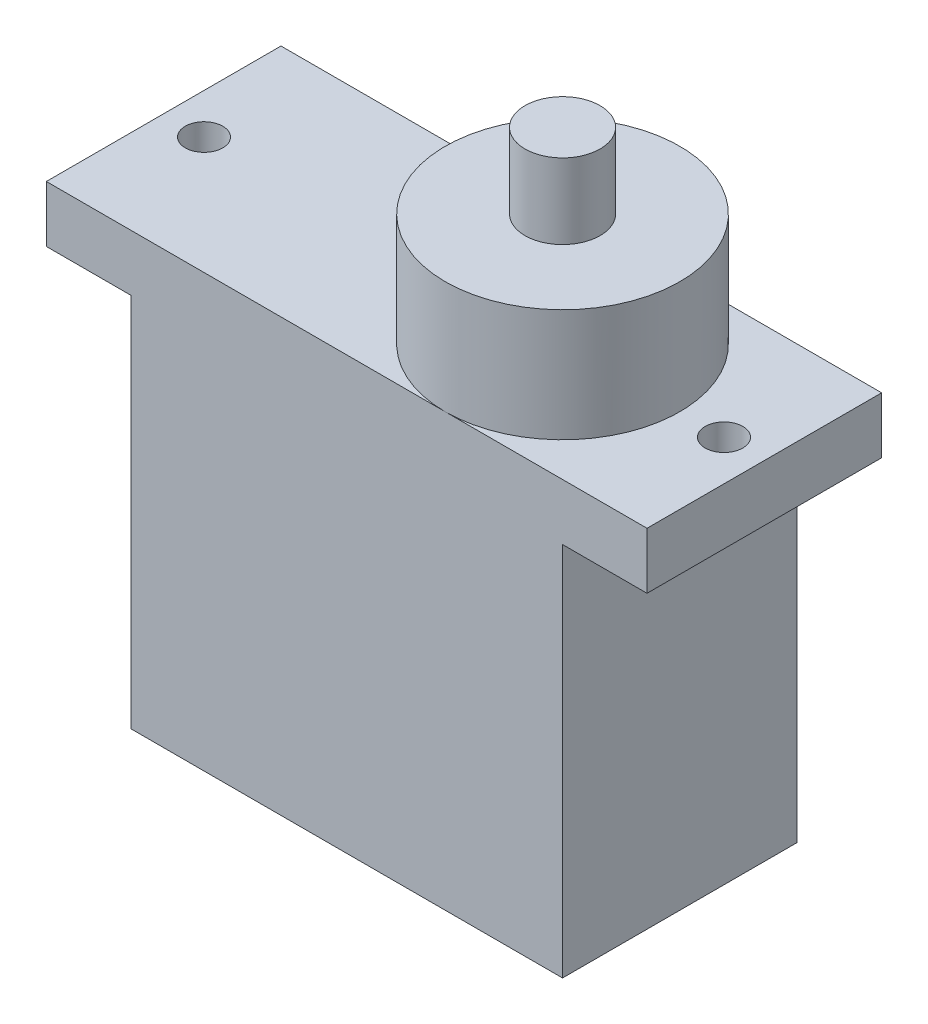
ISO-10303-21;
HEADER;
FILE_DESCRIPTION(('STEP AP214'),'2;1');
FILE_NAME('part.step','',(''),(''),'','','');
FILE_SCHEMA(('AUTOMOTIVE_DESIGN { 1 0 10303 214 1 1 1 1 }'));
ENDSEC;
DATA;
#1=APPLICATION_CONTEXT('core data for automotive mechanical design processes');
#2=APPLICATION_PROTOCOL_DEFINITION('international standard','automotive_design',2000,#1);
#3=PRODUCT_CONTEXT('',#1,'mechanical');
#4=PRODUCT('Part','Part','',(#3));
#5=PRODUCT_RELATED_PRODUCT_CATEGORY('part','',(#4));
#6=PRODUCT_DEFINITION_FORMATION('','',#4);
#7=PRODUCT_DEFINITION_CONTEXT('part definition',#1,'design');
#8=PRODUCT_DEFINITION('design','',#6,#7);
#9=PRODUCT_DEFINITION_SHAPE('','',#8);
#10=(LENGTH_UNIT() NAMED_UNIT(*) SI_UNIT(.MILLI.,.METRE.));
#11=(NAMED_UNIT(*) PLANE_ANGLE_UNIT() SI_UNIT($,.RADIAN.));
#12=(NAMED_UNIT(*) SI_UNIT($,.STERADIAN.) SOLID_ANGLE_UNIT());
#13=UNCERTAINTY_MEASURE_WITH_UNIT(LENGTH_MEASURE(1.E-05),#10,'distance_accuracy_value','');
#14=(GEOMETRIC_REPRESENTATION_CONTEXT(3) GLOBAL_UNCERTAINTY_ASSIGNED_CONTEXT((#13)) GLOBAL_UNIT_ASSIGNED_CONTEXT((#10,
#11,#12)) REPRESENTATION_CONTEXT('',''));
#15=CARTESIAN_POINT('',(0.,0.,0.));
#16=DIRECTION('',(0.,0.,1.));
#17=DIRECTION('',(1.,0.,0.));
#18=AXIS2_PLACEMENT_3D('',#15,#16,#17);
#19=CARTESIAN_POINT('',(0.,23.,0.));
#20=DIRECTION('',(0.,1.,0.));
#21=DIRECTION('',(0.,0.,1.));
#22=AXIS2_PLACEMENT_3D('',#19,#20,#21);
#23=PLANE('',#22);
#24=CARTESIAN_POINT('',(5.25,23.,0.));
#25=DIRECTION('',(0.,1.,0.));
#26=DIRECTION('',(0.,0.,1.));
#27=AXIS2_PLACEMENT_3D('',#24,#25,#26);
#28=CIRCLE('',#27,6.25);
#29=CARTESIAN_POINT('',(5.25,23.,6.25));
#30=VERTEX_POINT('',#29);
#31=CARTESIAN_POINT('',(5.25,23.,-6.25));
#32=VERTEX_POINT('',#31);
#33=EDGE_CURVE('E139',#30,#32,#28,.T.);
#34=ORIENTED_EDGE('',*,*,#33,.F.);
#35=DIRECTION('',(1.,0.,0.));
#36=VECTOR('',#35,1.);
#37=CARTESIAN_POINT('',(-16.,23.,6.25));
#38=LINE('',#37,#36);
#39=CARTESIAN_POINT('',(16.,23.,6.25));
#40=VERTEX_POINT('',#39);
#41=EDGE_CURVE('E127',#30,#40,#38,.T.);
#42=ORIENTED_EDGE('',*,*,#41,.T.);
#43=DIRECTION('',(0.,0.,-1.));
#44=VECTOR('',#43,1.);
#45=CARTESIAN_POINT('',(16.,23.,-6.25));
#46=LINE('',#45,#44);
#47=CARTESIAN_POINT('',(16.,23.,-6.25));
#48=VERTEX_POINT('',#47);
#49=EDGE_CURVE('E170',#40,#48,#46,.T.);
#50=ORIENTED_EDGE('',*,*,#49,.T.);
#51=DIRECTION('',(-1.,0.,0.));
#52=VECTOR('',#51,1.);
#53=CARTESIAN_POINT('',(-16.,23.,-6.25));
#54=LINE('',#53,#52);
#55=EDGE_CURVE('E141',#48,#32,#54,.T.);
#56=ORIENTED_EDGE('',*,*,#55,.T.);
#57=EDGE_LOOP('',(#34,#42,#50,#56));
#58=FACE_BOUND('',#57,.T.);
#59=CARTESIAN_POINT('',(13.85,23.,0.));
#60=DIRECTION('',(0.,1.,0.));
#61=DIRECTION('',(0.,0.,1.));
#62=AXIS2_PLACEMENT_3D('',#59,#60,#61);
#63=CIRCLE('',#62,1.);
#64=CARTESIAN_POINT('',(13.85,23.,0.999999999999999));
#65=VERTEX_POINT('',#64);
#66=EDGE_CURVE('E162',#65,#65,#63,.T.);
#67=ORIENTED_EDGE('',*,*,#66,.F.);
#68=EDGE_LOOP('',(#67));
#69=FACE_BOUND('',#68,.T.);
#70=ADVANCED_FACE('F39',(#58,#69),#23,.T.);
#71=CARTESIAN_POINT('',(11.5,20.,-6.25));
#72=DIRECTION('',(-1.,0.,0.));
#73=DIRECTION('',(0.,0.,1.));
#74=AXIS2_PLACEMENT_3D('',#71,#72,#73);
#75=PLANE('',#74);
#76=DIRECTION('',(0.,0.,-1.));
#77=VECTOR('',#76,1.);
#78=CARTESIAN_POINT('',(11.5,0.,-6.25));
#79=LINE('',#78,#77);
#80=CARTESIAN_POINT('',(11.5,0.,6.25));
#81=VERTEX_POINT('',#80);
#82=CARTESIAN_POINT('',(11.5,0.,-6.25));
#83=VERTEX_POINT('',#82);
#84=EDGE_CURVE('E207',#81,#83,#79,.T.);
#85=ORIENTED_EDGE('',*,*,#84,.T.);
#86=DIRECTION('',(0.,-1.,0.));
#87=VECTOR('',#86,1.);
#88=CARTESIAN_POINT('',(11.5,20.,-6.25));
#89=LINE('',#88,#87);
#90=CARTESIAN_POINT('',(11.5,20.,-6.25));
#91=VERTEX_POINT('',#90);
#92=EDGE_CURVE('E43',#91,#83,#89,.T.);
#93=ORIENTED_EDGE('',*,*,#92,.F.);
#94=DIRECTION('',(0.,0.,-1.));
#95=VECTOR('',#94,1.);
#96=CARTESIAN_POINT('',(11.5,20.,-6.25));
#97=LINE('',#96,#95);
#98=CARTESIAN_POINT('',(11.5,20.,6.25));
#99=VERTEX_POINT('',#98);
#100=EDGE_CURVE('E208',#99,#91,#97,.T.);
#101=ORIENTED_EDGE('',*,*,#100,.F.);
#102=DIRECTION('',(0.,-1.,0.));
#103=VECTOR('',#102,1.);
#104=CARTESIAN_POINT('',(11.5,20.,6.25));
#105=LINE('',#104,#103);
#106=EDGE_CURVE('E65',#99,#81,#105,.T.);
#107=ORIENTED_EDGE('',*,*,#106,.T.);
#108=EDGE_LOOP('',(#85,#93,#101,#107));
#109=FACE_BOUND('',#108,.T.);
#110=ADVANCED_FACE('F41',(#109),#75,.F.);
#111=CARTESIAN_POINT('',(-11.5,20.,-6.25));
#112=DIRECTION('',(0.,0.,1.));
#113=DIRECTION('',(1.,0.,0.));
#114=AXIS2_PLACEMENT_3D('',#111,#112,#113);
#115=PLANE('',#114);
#116=DIRECTION('',(-1.,0.,0.));
#117=VECTOR('',#116,1.);
#118=CARTESIAN_POINT('',(-11.5,0.,-6.25));
#119=LINE('',#118,#117);
#120=CARTESIAN_POINT('',(-11.5,0.,-6.25));
#121=VERTEX_POINT('',#120);
#122=EDGE_CURVE('E217',#83,#121,#119,.T.);
#123=ORIENTED_EDGE('',*,*,#122,.T.);
#124=DIRECTION('',(0.,-1.,0.));
#125=VECTOR('',#124,1.);
#126=CARTESIAN_POINT('',(-11.5,20.,-6.25));
#127=LINE('',#126,#125);
#128=CARTESIAN_POINT('',(-11.5,20.,-6.25));
#129=VERTEX_POINT('',#128);
#130=EDGE_CURVE('E150',#129,#121,#127,.T.);
#131=ORIENTED_EDGE('',*,*,#130,.F.);
#132=DIRECTION('',(-1.,0.,0.));
#133=VECTOR('',#132,1.);
#134=CARTESIAN_POINT('',(-16.,20.,-6.25));
#135=LINE('',#134,#133);
#136=CARTESIAN_POINT('',(-16.,20.,-6.25));
#137=VERTEX_POINT('',#136);
#138=EDGE_CURVE('E182',#129,#137,#135,.T.);
#139=ORIENTED_EDGE('',*,*,#138,.T.);
#140=DIRECTION('',(0.,-1.,0.));
#141=VECTOR('',#140,1.);
#142=CARTESIAN_POINT('',(-16.,23.,-6.25));
#143=LINE('',#142,#141);
#144=CARTESIAN_POINT('',(-16.,23.,-6.25));
#145=VERTEX_POINT('',#144);
#146=EDGE_CURVE('E199',#145,#137,#143,.T.);
#147=ORIENTED_EDGE('',*,*,#146,.F.);
#148=EDGE_CURVE('E173',#32,#145,#54,.T.);
#149=ORIENTED_EDGE('',*,*,#148,.F.);
#150=ORIENTED_EDGE('',*,*,#55,.F.);
#151=DIRECTION('',(0.,-1.,0.));
#152=VECTOR('',#151,1.);
#153=CARTESIAN_POINT('',(16.,23.,-6.25));
#154=LINE('',#153,#152);
#155=CARTESIAN_POINT('',(16.,20.,-6.25));
#156=VERTEX_POINT('',#155);
#157=EDGE_CURVE('E203',#48,#156,#154,.T.);
#158=ORIENTED_EDGE('',*,*,#157,.T.);
#159=EDGE_CURVE('E183',#156,#91,#135,.T.);
#160=ORIENTED_EDGE('',*,*,#159,.T.);
#161=ORIENTED_EDGE('',*,*,#92,.T.);
#162=EDGE_LOOP('',(#123,#131,#139,#147,#149,#150,#158,#160,#161));
#163=FACE_BOUND('',#162,.T.);
#164=ADVANCED_FACE('F281',(#163),#115,.F.);
#165=CARTESIAN_POINT('',(-11.5,20.,-6.25));
#166=DIRECTION('',(1.,0.,0.));
#167=DIRECTION('',(0.,0.,-1.));
#168=AXIS2_PLACEMENT_3D('',#165,#166,#167);
#169=PLANE('',#168);
#170=DIRECTION('',(0.,0.,1.));
#171=VECTOR('',#170,1.);
#172=CARTESIAN_POINT('',(-11.5,0.,-6.25));
#173=LINE('',#172,#171);
#174=CARTESIAN_POINT('',(-11.5,0.,6.25));
#175=VERTEX_POINT('',#174);
#176=EDGE_CURVE('E220',#121,#175,#173,.T.);
#177=ORIENTED_EDGE('',*,*,#176,.T.);
#178=DIRECTION('',(0.,-1.,0.));
#179=VECTOR('',#178,1.);
#180=CARTESIAN_POINT('',(-11.5,20.,6.25));
#181=LINE('',#180,#179);
#182=CARTESIAN_POINT('',(-11.5,20.,6.25));
#183=VERTEX_POINT('',#182);
#184=EDGE_CURVE('E227',#183,#175,#181,.T.);
#185=ORIENTED_EDGE('',*,*,#184,.F.);
#186=DIRECTION('',(0.,0.,1.));
#187=VECTOR('',#186,1.);
#188=CARTESIAN_POINT('',(-11.5,20.,-6.25));
#189=LINE('',#188,#187);
#190=EDGE_CURVE('E211',#129,#183,#189,.T.);
#191=ORIENTED_EDGE('',*,*,#190,.F.);
#192=ORIENTED_EDGE('',*,*,#130,.T.);
#193=EDGE_LOOP('',(#177,#185,#191,#192));
#194=FACE_BOUND('',#193,.T.);
#195=ADVANCED_FACE('F234',(#194),#169,.F.);
#196=CARTESIAN_POINT('',(-11.5,20.,6.25));
#197=DIRECTION('',(0.,0.,-1.));
#198=DIRECTION('',(-1.,0.,0.));
#199=AXIS2_PLACEMENT_3D('',#196,#197,#198);
#200=PLANE('',#199);
#201=DIRECTION('',(1.,0.,0.));
#202=VECTOR('',#201,1.);
#203=CARTESIAN_POINT('',(-11.5,0.,6.25));
#204=LINE('',#203,#202);
#205=EDGE_CURVE('E84',#175,#81,#204,.T.);
#206=ORIENTED_EDGE('',*,*,#205,.T.);
#207=ORIENTED_EDGE('',*,*,#106,.F.);
#208=DIRECTION('',(1.,0.,0.));
#209=VECTOR('',#208,1.);
#210=CARTESIAN_POINT('',(-16.,20.,6.25));
#211=LINE('',#210,#209);
#212=CARTESIAN_POINT('',(16.,20.,6.25));
#213=VERTEX_POINT('',#212);
#214=EDGE_CURVE('E190',#99,#213,#211,.T.);
#215=ORIENTED_EDGE('',*,*,#214,.T.);
#216=DIRECTION('',(0.,-1.,0.));
#217=VECTOR('',#216,1.);
#218=CARTESIAN_POINT('',(16.,23.,6.25));
#219=LINE('',#218,#217);
#220=EDGE_CURVE('E126',#40,#213,#219,.T.);
#221=ORIENTED_EDGE('',*,*,#220,.F.);
#222=ORIENTED_EDGE('',*,*,#41,.F.);
#223=CARTESIAN_POINT('',(-16.,23.,6.25));
#224=VERTEX_POINT('',#223);
#225=EDGE_CURVE('E117',#224,#30,#38,.T.);
#226=ORIENTED_EDGE('',*,*,#225,.F.);
#227=DIRECTION('',(0.,-1.,0.));
#228=VECTOR('',#227,1.);
#229=CARTESIAN_POINT('',(-16.,23.,6.25));
#230=LINE('',#229,#228);
#231=CARTESIAN_POINT('',(-16.,20.,6.25));
#232=VERTEX_POINT('',#231);
#233=EDGE_CURVE('E196',#224,#232,#230,.T.);
#234=ORIENTED_EDGE('',*,*,#233,.T.);
#235=EDGE_CURVE('E174',#232,#183,#211,.T.);
#236=ORIENTED_EDGE('',*,*,#235,.T.);
#237=ORIENTED_EDGE('',*,*,#184,.T.);
#238=EDGE_LOOP('',(#206,#207,#215,#221,#222,#226,#234,#236,#237));
#239=FACE_BOUND('',#238,.T.);
#240=ADVANCED_FACE('F131',(#239),#200,.F.);
#241=CARTESIAN_POINT('',(0.,0.,0.));
#242=DIRECTION('',(0.,1.,0.));
#243=DIRECTION('',(0.,0.,1.));
#244=AXIS2_PLACEMENT_3D('',#241,#242,#243);
#245=PLANE('',#244);
#246=ORIENTED_EDGE('',*,*,#84,.F.);
#247=ORIENTED_EDGE('',*,*,#205,.F.);
#248=ORIENTED_EDGE('',*,*,#176,.F.);
#249=ORIENTED_EDGE('',*,*,#122,.F.);
#250=EDGE_LOOP('',(#246,#247,#248,#249));
#251=FACE_BOUND('',#250,.T.);
#252=ADVANCED_FACE('F239',(#251),#245,.F.);
#253=CARTESIAN_POINT('',(0.,20.,0.));
#254=DIRECTION('',(0.,1.,0.));
#255=DIRECTION('',(0.,0.,1.));
#256=AXIS2_PLACEMENT_3D('',#253,#254,#255);
#257=PLANE('',#256);
#258=CARTESIAN_POINT('',(13.85,20.,0.));
#259=DIRECTION('',(0.,1.,0.));
#260=DIRECTION('',(0.,0.,1.));
#261=AXIS2_PLACEMENT_3D('',#258,#259,#260);
#262=CIRCLE('',#261,1.);
#263=CARTESIAN_POINT('',(13.85,20.,0.999999999999999));
#264=VERTEX_POINT('',#263);
#265=EDGE_CURVE('E157',#264,#264,#262,.T.);
#266=ORIENTED_EDGE('',*,*,#265,.T.);
#267=EDGE_LOOP('',(#266));
#268=FACE_BOUND('',#267,.T.);
#269=ORIENTED_EDGE('',*,*,#214,.F.);
#270=ORIENTED_EDGE('',*,*,#100,.T.);
#271=ORIENTED_EDGE('',*,*,#159,.F.);
#272=DIRECTION('',(0.,0.,-1.));
#273=VECTOR('',#272,1.);
#274=CARTESIAN_POINT('',(16.,20.,-6.25));
#275=LINE('',#274,#273);
#276=EDGE_CURVE('E166',#213,#156,#275,.T.);
#277=ORIENTED_EDGE('',*,*,#276,.F.);
#278=EDGE_LOOP('',(#269,#270,#271,#277));
#279=FACE_BOUND('',#278,.T.);
#280=ADVANCED_FACE('F243',(#268,#279),#257,.F.);
#281=CARTESIAN_POINT('',(-13.85,20.,0.));
#282=DIRECTION('',(0.,1.,0.));
#283=DIRECTION('',(0.,0.,-1.));
#284=AXIS2_PLACEMENT_3D('',#281,#282,#283);
#285=CIRCLE('',#284,1.);
#286=CARTESIAN_POINT('',(-13.85,20.,-1.));
#287=VERTEX_POINT('',#286);
#288=EDGE_CURVE('E158',#287,#287,#285,.T.);
#289=ORIENTED_EDGE('',*,*,#288,.T.);
#290=EDGE_LOOP('',(#289));
#291=FACE_BOUND('',#290,.T.);
#292=ORIENTED_EDGE('',*,*,#138,.F.);
#293=ORIENTED_EDGE('',*,*,#190,.T.);
#294=ORIENTED_EDGE('',*,*,#235,.F.);
#295=DIRECTION('',(0.,0.,1.));
#296=VECTOR('',#295,1.);
#297=CARTESIAN_POINT('',(-16.,20.,-6.25));
#298=LINE('',#297,#296);
#299=EDGE_CURVE('E187',#137,#232,#298,.T.);
#300=ORIENTED_EDGE('',*,*,#299,.F.);
#301=EDGE_LOOP('',(#292,#293,#294,#300));
#302=FACE_BOUND('',#301,.T.);
#303=ADVANCED_FACE('F286',(#291,#302),#257,.F.);
#304=EDGE_CURVE('E49',#32,#30,#28,.T.);
#305=ORIENTED_EDGE('',*,*,#304,.F.);
#306=ORIENTED_EDGE('',*,*,#148,.T.);
#307=DIRECTION('',(0.,0.,1.));
#308=VECTOR('',#307,1.);
#309=CARTESIAN_POINT('',(-16.,23.,-6.25));
#310=LINE('',#309,#308);
#311=EDGE_CURVE('E122',#145,#224,#310,.T.);
#312=ORIENTED_EDGE('',*,*,#311,.T.);
#313=ORIENTED_EDGE('',*,*,#225,.T.);
#314=EDGE_LOOP('',(#305,#306,#312,#313));
#315=FACE_BOUND('',#314,.T.);
#316=CARTESIAN_POINT('',(-13.85,23.,0.));
#317=DIRECTION('',(0.,1.,0.));
#318=DIRECTION('',(0.,0.,-1.));
#319=AXIS2_PLACEMENT_3D('',#316,#317,#318);
#320=CIRCLE('',#319,1.);
#321=CARTESIAN_POINT('',(-13.85,23.,-1.));
#322=VERTEX_POINT('',#321);
#323=EDGE_CURVE('E153',#322,#322,#320,.T.);
#324=ORIENTED_EDGE('',*,*,#323,.F.);
#325=EDGE_LOOP('',(#324));
#326=FACE_BOUND('',#325,.T.);
#327=ADVANCED_FACE('F119',(#315,#326),#23,.T.);
#328=CARTESIAN_POINT('',(16.,23.,-6.25));
#329=DIRECTION('',(-1.,0.,0.));
#330=DIRECTION('',(0.,0.,1.));
#331=AXIS2_PLACEMENT_3D('',#328,#329,#330);
#332=PLANE('',#331);
#333=ORIENTED_EDGE('',*,*,#276,.T.);
#334=ORIENTED_EDGE('',*,*,#157,.F.);
#335=ORIENTED_EDGE('',*,*,#49,.F.);
#336=ORIENTED_EDGE('',*,*,#220,.T.);
#337=EDGE_LOOP('',(#333,#334,#335,#336));
#338=FACE_BOUND('',#337,.T.);
#339=ADVANCED_FACE('F285',(#338),#332,.F.);
#340=CARTESIAN_POINT('',(-16.,23.,-6.25));
#341=DIRECTION('',(1.,0.,0.));
#342=DIRECTION('',(0.,0.,-1.));
#343=AXIS2_PLACEMENT_3D('',#340,#341,#342);
#344=PLANE('',#343);
#345=ORIENTED_EDGE('',*,*,#299,.T.);
#346=ORIENTED_EDGE('',*,*,#233,.F.);
#347=ORIENTED_EDGE('',*,*,#311,.F.);
#348=ORIENTED_EDGE('',*,*,#146,.T.);
#349=EDGE_LOOP('',(#345,#346,#347,#348));
#350=FACE_BOUND('',#349,.T.);
#351=ADVANCED_FACE('F291',(#350),#344,.F.);
#352=CARTESIAN_POINT('',(13.85,23.,0.));
#353=DIRECTION('',(0.,-1.,0.));
#354=DIRECTION('',(0.,0.,-1.));
#355=AXIS2_PLACEMENT_3D('',#352,#353,#354);
#356=CYLINDRICAL_SURFACE('',#355,1.);
#357=ORIENTED_EDGE('',*,*,#66,.T.);
#358=EDGE_LOOP('',(#357));
#359=FACE_BOUND('',#358,.T.);
#360=ORIENTED_EDGE('',*,*,#265,.F.);
#361=EDGE_LOOP('',(#360));
#362=FACE_BOUND('',#361,.T.);
#363=ADVANCED_FACE('F273',(#359,#362),#356,.F.);
#364=CARTESIAN_POINT('',(-13.85,23.,0.));
#365=DIRECTION('',(0.,-1.,0.));
#366=DIRECTION('',(0.,0.,-1.));
#367=AXIS2_PLACEMENT_3D('',#364,#365,#366);
#368=CYLINDRICAL_SURFACE('',#367,1.);
#369=ORIENTED_EDGE('',*,*,#323,.T.);
#370=EDGE_LOOP('',(#369));
#371=FACE_BOUND('',#370,.T.);
#372=ORIENTED_EDGE('',*,*,#288,.F.);
#373=EDGE_LOOP('',(#372));
#374=FACE_BOUND('',#373,.T.);
#375=ADVANCED_FACE('F268',(#371,#374),#368,.F.);
#376=CARTESIAN_POINT('',(5.25,29.,0.));
#377=DIRECTION('',(0.,-1.,0.));
#378=DIRECTION('',(0.,0.,-1.));
#379=AXIS2_PLACEMENT_3D('',#376,#377,#378);
#380=CYLINDRICAL_SURFACE('',#379,6.25);
#381=CARTESIAN_POINT('',(5.25,29.,0.));
#382=DIRECTION('',(0.,1.,0.));
#383=DIRECTION('',(0.,0.,1.));
#384=AXIS2_PLACEMENT_3D('',#381,#382,#383);
#385=CIRCLE('',#384,6.25);
#386=CARTESIAN_POINT('',(5.25,29.,6.25));
#387=VERTEX_POINT('',#386);
#388=EDGE_CURVE('E144',#387,#387,#385,.T.);
#389=ORIENTED_EDGE('',*,*,#388,.F.);
#390=EDGE_LOOP('',(#389));
#391=FACE_BOUND('',#390,.T.);
#392=ORIENTED_EDGE('',*,*,#33,.T.);
#393=ORIENTED_EDGE('',*,*,#304,.T.);
#394=EDGE_LOOP('',(#392,#393));
#395=FACE_BOUND('',#394,.T.);
#396=ADVANCED_FACE('F147',(#391,#395),#380,.T.);
#397=CARTESIAN_POINT('',(5.25,29.,0.));
#398=DIRECTION('',(0.,1.,0.));
#399=DIRECTION('',(0.,0.,1.));
#400=AXIS2_PLACEMENT_3D('',#397,#398,#399);
#401=PLANE('',#400);
#402=CARTESIAN_POINT('',(5.25,29.,0.));
#403=DIRECTION('',(0.,1.,0.));
#404=DIRECTION('',(0.,0.,1.));
#405=AXIS2_PLACEMENT_3D('',#402,#403,#404);
#406=CIRCLE('',#405,2.);
#407=CARTESIAN_POINT('',(5.25,29.,2.));
#408=VERTEX_POINT('',#407);
#409=EDGE_CURVE('E11',#408,#408,#406,.T.);
#410=ORIENTED_EDGE('',*,*,#409,.F.);
#411=EDGE_LOOP('',(#410));
#412=FACE_BOUND('',#411,.T.);
#413=ORIENTED_EDGE('',*,*,#388,.T.);
#414=EDGE_LOOP('',(#413));
#415=FACE_BOUND('',#414,.T.);
#416=ADVANCED_FACE('F258',(#412,#415),#401,.T.);
#417=CARTESIAN_POINT('',(5.25,33.,0.));
#418=DIRECTION('',(0.,-1.,0.));
#419=DIRECTION('',(0.,0.,-1.));
#420=AXIS2_PLACEMENT_3D('',#417,#418,#419);
#421=CYLINDRICAL_SURFACE('',#420,2.);
#422=CARTESIAN_POINT('',(5.25,33.,0.));
#423=DIRECTION('',(0.,1.,0.));
#424=DIRECTION('',(0.,0.,1.));
#425=AXIS2_PLACEMENT_3D('',#422,#423,#424);
#426=CIRCLE('',#425,2.);
#427=CARTESIAN_POINT('',(5.25,33.,2.));
#428=VERTEX_POINT('',#427);
#429=EDGE_CURVE('E145',#428,#428,#426,.T.);
#430=ORIENTED_EDGE('',*,*,#429,.F.);
#431=EDGE_LOOP('',(#430));
#432=FACE_BOUND('',#431,.T.);
#433=ORIENTED_EDGE('',*,*,#409,.T.);
#434=EDGE_LOOP('',(#433));
#435=FACE_BOUND('',#434,.T.);
#436=ADVANCED_FACE('F255',(#432,#435),#421,.T.);
#437=CARTESIAN_POINT('',(5.25,33.,0.));
#438=DIRECTION('',(0.,1.,0.));
#439=DIRECTION('',(0.,0.,1.));
#440=AXIS2_PLACEMENT_3D('',#437,#438,#439);
#441=PLANE('',#440);
#442=ORIENTED_EDGE('',*,*,#429,.T.);
#443=EDGE_LOOP('',(#442));
#444=FACE_BOUND('',#443,.T.);
#445=ADVANCED_FACE('F253',(#444),#441,.T.);
#446=CLOSED_SHELL('',(#70,#110,#164,#195,#240,#252,#280,#303,#327,#339,#351,#363,#375,#396,#416,
#436,#445));
#447=MANIFOLD_SOLID_BREP('B2',#446);
#448=ADVANCED_BREP_SHAPE_REPRESENTATION('',(#18,#447),#14);
#449=SHAPE_DEFINITION_REPRESENTATION(#9,#448);
ENDSEC;
END-ISO-10303-21;
